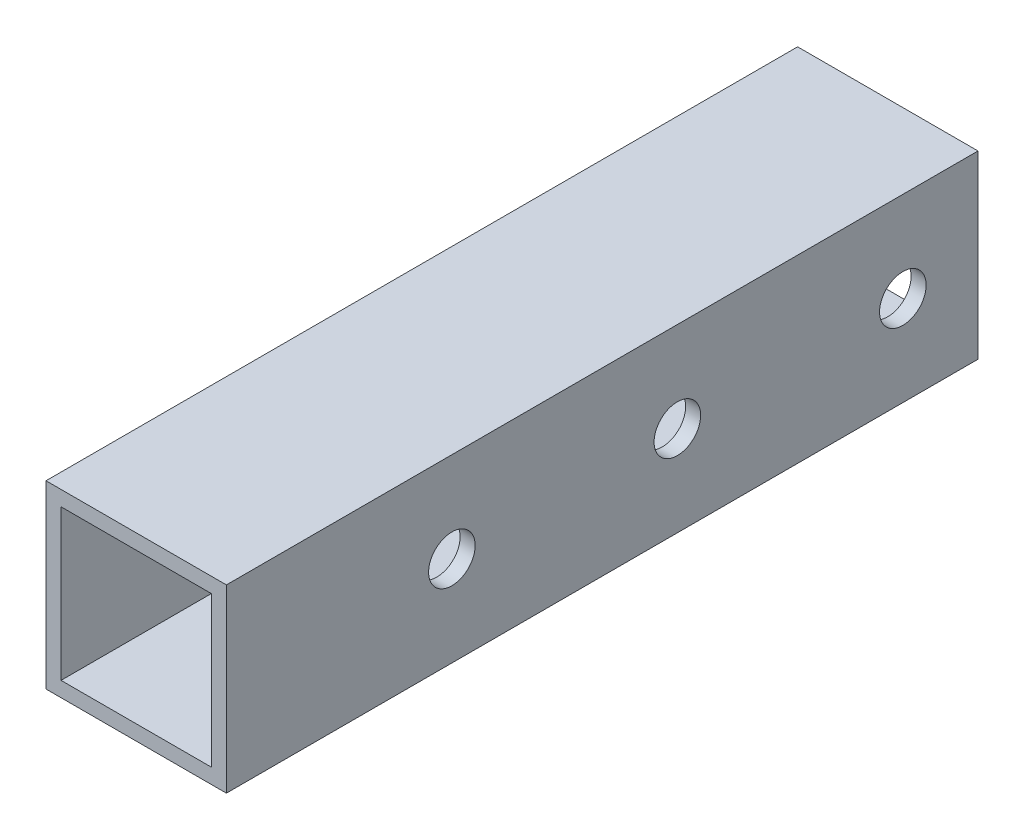
ISO-10303-21;
HEADER;
FILE_DESCRIPTION(('STEP AP214'),'2;1');
FILE_NAME('part.step','',(''),(''),'','','');
FILE_SCHEMA(('AUTOMOTIVE_DESIGN { 1 0 10303 214 1 1 1 1 }'));
ENDSEC;
DATA;
#1=APPLICATION_CONTEXT('core data for automotive mechanical design processes');
#2=APPLICATION_PROTOCOL_DEFINITION('international standard','automotive_design',2000,#1);
#3=PRODUCT_CONTEXT('',#1,'mechanical');
#4=PRODUCT('Part','Part','',(#3));
#5=PRODUCT_RELATED_PRODUCT_CATEGORY('part','',(#4));
#6=PRODUCT_DEFINITION_FORMATION('','',#4);
#7=PRODUCT_DEFINITION_CONTEXT('part definition',#1,'design');
#8=PRODUCT_DEFINITION('design','',#6,#7);
#9=PRODUCT_DEFINITION_SHAPE('','',#8);
#10=(LENGTH_UNIT() NAMED_UNIT(*) SI_UNIT(.MILLI.,.METRE.));
#11=(NAMED_UNIT(*) PLANE_ANGLE_UNIT() SI_UNIT($,.RADIAN.));
#12=(NAMED_UNIT(*) SI_UNIT($,.STERADIAN.) SOLID_ANGLE_UNIT());
#13=UNCERTAINTY_MEASURE_WITH_UNIT(LENGTH_MEASURE(1.E-05),#10,'distance_accuracy_value','');
#14=(GEOMETRIC_REPRESENTATION_CONTEXT(3) GLOBAL_UNCERTAINTY_ASSIGNED_CONTEXT((#13)) GLOBAL_UNIT_ASSIGNED_CONTEXT((#10,
#11,#12)) REPRESENTATION_CONTEXT('',''));
#15=CARTESIAN_POINT('',(0.,0.,0.));
#16=DIRECTION('',(0.,0.,1.));
#17=DIRECTION('',(1.,0.,0.));
#18=AXIS2_PLACEMENT_3D('',#15,#16,#17);
#19=CARTESIAN_POINT('',(0.,0.,-50.));
#20=DIRECTION('',(0.,0.,1.));
#21=DIRECTION('',(-1.,0.,0.));
#22=AXIS2_PLACEMENT_3D('',#19,#20,#21);
#23=PLANE('',#22);
#24=DIRECTION('',(0.,-1.,0.));
#25=VECTOR('',#24,1.);
#26=CARTESIAN_POINT('',(0.,0.,-50.));
#27=LINE('',#26,#25);
#28=CARTESIAN_POINT('',(0.,12.,-50.));
#29=VERTEX_POINT('',#28);
#30=CARTESIAN_POINT('',(0.,0.,-50.));
#31=VERTEX_POINT('',#30);
#32=EDGE_CURVE('E147',#29,#31,#27,.T.);
#33=ORIENTED_EDGE('',*,*,#32,.F.);
#34=DIRECTION('',(-1.,0.,0.));
#35=VECTOR('',#34,1.);
#36=CARTESIAN_POINT('',(0.,12.,-50.));
#37=LINE('',#36,#35);
#38=CARTESIAN_POINT('',(12.,12.,-50.));
#39=VERTEX_POINT('',#38);
#40=EDGE_CURVE('E157',#39,#29,#37,.T.);
#41=ORIENTED_EDGE('',*,*,#40,.F.);
#42=DIRECTION('',(0.,1.,0.));
#43=VECTOR('',#42,1.);
#44=CARTESIAN_POINT('',(12.,0.,-50.));
#45=LINE('',#44,#43);
#46=CARTESIAN_POINT('',(12.,0.,-50.));
#47=VERTEX_POINT('',#46);
#48=EDGE_CURVE('E154',#47,#39,#45,.T.);
#49=ORIENTED_EDGE('',*,*,#48,.F.);
#50=DIRECTION('',(1.,0.,0.));
#51=VECTOR('',#50,1.);
#52=CARTESIAN_POINT('',(0.,0.,-50.));
#53=LINE('',#52,#51);
#54=EDGE_CURVE('E150',#31,#47,#53,.T.);
#55=ORIENTED_EDGE('',*,*,#54,.F.);
#56=EDGE_LOOP('',(#33,#41,#49,#55));
#57=FACE_BOUND('',#56,.T.);
#58=DIRECTION('',(1.,0.,0.));
#59=VECTOR('',#58,1.);
#60=CARTESIAN_POINT('',(1.,1.,-50.));
#61=LINE('',#60,#59);
#62=CARTESIAN_POINT('',(1.,1.,-50.));
#63=VERTEX_POINT('',#62);
#64=CARTESIAN_POINT('',(11.,1.,-50.));
#65=VERTEX_POINT('',#64);
#66=EDGE_CURVE('E112',#63,#65,#61,.T.);
#67=ORIENTED_EDGE('',*,*,#66,.T.);
#68=DIRECTION('',(0.,1.,0.));
#69=VECTOR('',#68,1.);
#70=CARTESIAN_POINT('',(11.,1.,-50.));
#71=LINE('',#70,#69);
#72=CARTESIAN_POINT('',(11.,11.,-50.));
#73=VERTEX_POINT('',#72);
#74=EDGE_CURVE('E121',#65,#73,#71,.T.);
#75=ORIENTED_EDGE('',*,*,#74,.T.);
#76=DIRECTION('',(-1.,0.,0.));
#77=VECTOR('',#76,1.);
#78=CARTESIAN_POINT('',(1.,11.,-50.));
#79=LINE('',#78,#77);
#80=CARTESIAN_POINT('',(1.,11.,-50.));
#81=VERTEX_POINT('',#80);
#82=EDGE_CURVE('E125',#73,#81,#79,.T.);
#83=ORIENTED_EDGE('',*,*,#82,.T.);
#84=DIRECTION('',(0.,-1.,0.));
#85=VECTOR('',#84,1.);
#86=CARTESIAN_POINT('',(1.,1.,-50.));
#87=LINE('',#86,#85);
#88=EDGE_CURVE('E128',#81,#63,#87,.T.);
#89=ORIENTED_EDGE('',*,*,#88,.T.);
#90=EDGE_LOOP('',(#67,#75,#83,#89));
#91=FACE_BOUND('',#90,.T.);
#92=ADVANCED_FACE('F43',(#57,#91),#23,.F.);
#93=CARTESIAN_POINT('',(0.,0.,0.));
#94=DIRECTION('',(0.,0.,1.));
#95=DIRECTION('',(-1.,0.,0.));
#96=AXIS2_PLACEMENT_3D('',#93,#94,#95);
#97=PLANE('',#96);
#98=DIRECTION('',(0.,-1.,0.));
#99=VECTOR('',#98,1.);
#100=CARTESIAN_POINT('',(0.,0.,0.));
#101=LINE('',#100,#99);
#102=CARTESIAN_POINT('',(0.,12.,0.));
#103=VERTEX_POINT('',#102);
#104=CARTESIAN_POINT('',(0.,0.,0.));
#105=VERTEX_POINT('',#104);
#106=EDGE_CURVE('E117',#103,#105,#101,.T.);
#107=ORIENTED_EDGE('',*,*,#106,.T.);
#108=DIRECTION('',(1.,0.,0.));
#109=VECTOR('',#108,1.);
#110=CARTESIAN_POINT('',(0.,0.,0.));
#111=LINE('',#110,#109);
#112=CARTESIAN_POINT('',(12.,0.,0.));
#113=VERTEX_POINT('',#112);
#114=EDGE_CURVE('E163',#105,#113,#111,.T.);
#115=ORIENTED_EDGE('',*,*,#114,.T.);
#116=DIRECTION('',(0.,1.,0.));
#117=VECTOR('',#116,1.);
#118=CARTESIAN_POINT('',(12.,0.,0.));
#119=LINE('',#118,#117);
#120=CARTESIAN_POINT('',(12.,12.,0.));
#121=VERTEX_POINT('',#120);
#122=EDGE_CURVE('E166',#113,#121,#119,.T.);
#123=ORIENTED_EDGE('',*,*,#122,.T.);
#124=DIRECTION('',(-1.,0.,0.));
#125=VECTOR('',#124,1.);
#126=CARTESIAN_POINT('',(0.,12.,0.));
#127=LINE('',#126,#125);
#128=EDGE_CURVE('E151',#121,#103,#127,.T.);
#129=ORIENTED_EDGE('',*,*,#128,.T.);
#130=EDGE_LOOP('',(#107,#115,#123,#129));
#131=FACE_BOUND('',#130,.T.);
#132=DIRECTION('',(0.,-1.,0.));
#133=VECTOR('',#132,1.);
#134=CARTESIAN_POINT('',(1.,1.,0.));
#135=LINE('',#134,#133);
#136=CARTESIAN_POINT('',(1.,11.,0.));
#137=VERTEX_POINT('',#136);
#138=CARTESIAN_POINT('',(1.,1.,0.));
#139=VERTEX_POINT('',#138);
#140=EDGE_CURVE('E129',#137,#139,#135,.T.);
#141=ORIENTED_EDGE('',*,*,#140,.F.);
#142=DIRECTION('',(-1.,0.,0.));
#143=VECTOR('',#142,1.);
#144=CARTESIAN_POINT('',(1.,11.,0.));
#145=LINE('',#144,#143);
#146=CARTESIAN_POINT('',(11.,11.,0.));
#147=VERTEX_POINT('',#146);
#148=EDGE_CURVE('E132',#147,#137,#145,.T.);
#149=ORIENTED_EDGE('',*,*,#148,.F.);
#150=DIRECTION('',(0.,1.,0.));
#151=VECTOR('',#150,1.);
#152=CARTESIAN_POINT('',(11.,1.,0.));
#153=LINE('',#152,#151);
#154=CARTESIAN_POINT('',(11.,1.,0.));
#155=VERTEX_POINT('',#154);
#156=EDGE_CURVE('E141',#155,#147,#153,.T.);
#157=ORIENTED_EDGE('',*,*,#156,.F.);
#158=DIRECTION('',(1.,0.,0.));
#159=VECTOR('',#158,1.);
#160=CARTESIAN_POINT('',(1.,1.,0.));
#161=LINE('',#160,#159);
#162=EDGE_CURVE('E113',#139,#155,#161,.T.);
#163=ORIENTED_EDGE('',*,*,#162,.F.);
#164=EDGE_LOOP('',(#141,#149,#157,#163));
#165=FACE_BOUND('',#164,.T.);
#166=ADVANCED_FACE('F224',(#131,#165),#97,.T.);
#167=CARTESIAN_POINT('',(0.,0.,-50.));
#168=DIRECTION('',(1.,0.,0.));
#169=DIRECTION('',(0.,0.,1.));
#170=AXIS2_PLACEMENT_3D('',#167,#168,#169);
#171=PLANE('',#170);
#172=CARTESIAN_POINT('',(0.,6.,-15.));
#173=DIRECTION('',(1.,0.,0.));
#174=DIRECTION('',(0.,0.,-1.));
#175=AXIS2_PLACEMENT_3D('',#172,#173,#174);
#176=CIRCLE('',#175,1.55);
#177=CARTESIAN_POINT('',(0.,6.,-16.55));
#178=VERTEX_POINT('',#177);
#179=EDGE_CURVE('E202',#178,#178,#176,.T.);
#180=ORIENTED_EDGE('',*,*,#179,.T.);
#181=EDGE_LOOP('',(#180));
#182=FACE_BOUND('',#181,.T.);
#183=CARTESIAN_POINT('',(0.,6.,-30.));
#184=DIRECTION('',(1.,0.,0.));
#185=DIRECTION('',(0.,0.,-1.));
#186=AXIS2_PLACEMENT_3D('',#183,#184,#185);
#187=CIRCLE('',#186,1.55);
#188=CARTESIAN_POINT('',(0.,6.,-31.55));
#189=VERTEX_POINT('',#188);
#190=EDGE_CURVE('E199',#189,#189,#187,.T.);
#191=ORIENTED_EDGE('',*,*,#190,.T.);
#192=EDGE_LOOP('',(#191));
#193=FACE_BOUND('',#192,.T.);
#194=CARTESIAN_POINT('',(0.,6.,-45.));
#195=DIRECTION('',(1.,0.,0.));
#196=DIRECTION('',(0.,0.,-1.));
#197=AXIS2_PLACEMENT_3D('',#194,#195,#196);
#198=CIRCLE('',#197,1.55);
#199=CARTESIAN_POINT('',(0.,6.,-46.55));
#200=VERTEX_POINT('',#199);
#201=EDGE_CURVE('E193',#200,#200,#198,.T.);
#202=ORIENTED_EDGE('',*,*,#201,.T.);
#203=EDGE_LOOP('',(#202));
#204=FACE_BOUND('',#203,.T.);
#205=ORIENTED_EDGE('',*,*,#106,.F.);
#206=DIRECTION('',(0.,0.,1.));
#207=VECTOR('',#206,1.);
#208=CARTESIAN_POINT('',(0.,12.,-50.));
#209=LINE('',#208,#207);
#210=EDGE_CURVE('E160',#29,#103,#209,.T.);
#211=ORIENTED_EDGE('',*,*,#210,.F.);
#212=ORIENTED_EDGE('',*,*,#32,.T.);
#213=DIRECTION('',(0.,0.,1.));
#214=VECTOR('',#213,1.);
#215=CARTESIAN_POINT('',(0.,0.,-50.));
#216=LINE('',#215,#214);
#217=EDGE_CURVE('E11',#31,#105,#216,.T.);
#218=ORIENTED_EDGE('',*,*,#217,.T.);
#219=EDGE_LOOP('',(#205,#211,#212,#218));
#220=FACE_BOUND('',#219,.T.);
#221=ADVANCED_FACE('F45',(#182,#193,#204,#220),#171,.F.);
#222=CARTESIAN_POINT('',(0.,0.,-50.));
#223=DIRECTION('',(0.,1.,0.));
#224=DIRECTION('',(0.,0.,-1.));
#225=AXIS2_PLACEMENT_3D('',#222,#223,#224);
#226=PLANE('',#225);
#227=ORIENTED_EDGE('',*,*,#114,.F.);
#228=ORIENTED_EDGE('',*,*,#217,.F.);
#229=ORIENTED_EDGE('',*,*,#54,.T.);
#230=DIRECTION('',(0.,0.,1.));
#231=VECTOR('',#230,1.);
#232=CARTESIAN_POINT('',(12.,0.,-50.));
#233=LINE('',#232,#231);
#234=EDGE_CURVE('E52',#47,#113,#233,.T.);
#235=ORIENTED_EDGE('',*,*,#234,.T.);
#236=EDGE_LOOP('',(#227,#228,#229,#235));
#237=FACE_BOUND('',#236,.T.);
#238=ADVANCED_FACE('F214',(#237),#226,.F.);
#239=CARTESIAN_POINT('',(12.,0.,-50.));
#240=DIRECTION('',(-1.,0.,0.));
#241=DIRECTION('',(0.,0.,-1.));
#242=AXIS2_PLACEMENT_3D('',#239,#240,#241);
#243=PLANE('',#242);
#244=CARTESIAN_POINT('',(12.,6.,-15.));
#245=DIRECTION('',(1.,0.,0.));
#246=DIRECTION('',(0.,0.,-1.));
#247=AXIS2_PLACEMENT_3D('',#244,#245,#246);
#248=CIRCLE('',#247,1.55);
#249=CARTESIAN_POINT('',(12.,6.,-16.55));
#250=VERTEX_POINT('',#249);
#251=EDGE_CURVE('E178',#250,#250,#248,.T.);
#252=ORIENTED_EDGE('',*,*,#251,.F.);
#253=EDGE_LOOP('',(#252));
#254=FACE_BOUND('',#253,.T.);
#255=CARTESIAN_POINT('',(12.,6.,-30.));
#256=DIRECTION('',(1.,0.,0.));
#257=DIRECTION('',(0.,0.,-1.));
#258=AXIS2_PLACEMENT_3D('',#255,#256,#257);
#259=CIRCLE('',#258,1.55);
#260=CARTESIAN_POINT('',(12.,6.,-31.55));
#261=VERTEX_POINT('',#260);
#262=EDGE_CURVE('E196',#261,#261,#259,.T.);
#263=ORIENTED_EDGE('',*,*,#262,.F.);
#264=EDGE_LOOP('',(#263));
#265=FACE_BOUND('',#264,.T.);
#266=CARTESIAN_POINT('',(12.,6.,-45.));
#267=DIRECTION('',(1.,0.,0.));
#268=DIRECTION('',(0.,0.,-1.));
#269=AXIS2_PLACEMENT_3D('',#266,#267,#268);
#270=CIRCLE('',#269,1.55);
#271=CARTESIAN_POINT('',(12.,6.,-46.55));
#272=VERTEX_POINT('',#271);
#273=EDGE_CURVE('E190',#272,#272,#270,.T.);
#274=ORIENTED_EDGE('',*,*,#273,.F.);
#275=EDGE_LOOP('',(#274));
#276=FACE_BOUND('',#275,.T.);
#277=ORIENTED_EDGE('',*,*,#122,.F.);
#278=ORIENTED_EDGE('',*,*,#234,.F.);
#279=ORIENTED_EDGE('',*,*,#48,.T.);
#280=DIRECTION('',(0.,0.,1.));
#281=VECTOR('',#280,1.);
#282=CARTESIAN_POINT('',(12.,12.,-50.));
#283=LINE('',#282,#281);
#284=EDGE_CURVE('E172',#39,#121,#283,.T.);
#285=ORIENTED_EDGE('',*,*,#284,.T.);
#286=EDGE_LOOP('',(#277,#278,#279,#285));
#287=FACE_BOUND('',#286,.T.);
#288=ADVANCED_FACE('F210',(#254,#265,#276,#287),#243,.F.);
#289=CARTESIAN_POINT('',(0.,12.,-50.));
#290=DIRECTION('',(0.,-1.,0.));
#291=DIRECTION('',(0.,0.,1.));
#292=AXIS2_PLACEMENT_3D('',#289,#290,#291);
#293=PLANE('',#292);
#294=ORIENTED_EDGE('',*,*,#128,.F.);
#295=ORIENTED_EDGE('',*,*,#284,.F.);
#296=ORIENTED_EDGE('',*,*,#40,.T.);
#297=ORIENTED_EDGE('',*,*,#210,.T.);
#298=EDGE_LOOP('',(#294,#295,#296,#297));
#299=FACE_BOUND('',#298,.T.);
#300=ADVANCED_FACE('F213',(#299),#293,.F.);
#301=CARTESIAN_POINT('',(1.,1.,-50.));
#302=DIRECTION('',(0.,1.,0.));
#303=DIRECTION('',(0.,0.,-1.));
#304=AXIS2_PLACEMENT_3D('',#301,#302,#303);
#305=PLANE('',#304);
#306=ORIENTED_EDGE('',*,*,#162,.T.);
#307=DIRECTION('',(0.,0.,1.));
#308=VECTOR('',#307,1.);
#309=CARTESIAN_POINT('',(11.,1.,-50.));
#310=LINE('',#309,#308);
#311=EDGE_CURVE('E108',#65,#155,#310,.T.);
#312=ORIENTED_EDGE('',*,*,#311,.F.);
#313=ORIENTED_EDGE('',*,*,#66,.F.);
#314=DIRECTION('',(0.,0.,1.));
#315=VECTOR('',#314,1.);
#316=CARTESIAN_POINT('',(1.,1.,-50.));
#317=LINE('',#316,#315);
#318=EDGE_CURVE('E68',#63,#139,#317,.T.);
#319=ORIENTED_EDGE('',*,*,#318,.T.);
#320=EDGE_LOOP('',(#306,#312,#313,#319));
#321=FACE_BOUND('',#320,.T.);
#322=ADVANCED_FACE('F110',(#321),#305,.T.);
#323=CARTESIAN_POINT('',(11.,1.,-50.));
#324=DIRECTION('',(-1.,0.,0.));
#325=DIRECTION('',(0.,0.,-1.));
#326=AXIS2_PLACEMENT_3D('',#323,#324,#325);
#327=PLANE('',#326);
#328=CARTESIAN_POINT('',(11.,6.,-15.));
#329=DIRECTION('',(1.,0.,0.));
#330=DIRECTION('',(0.,0.,-1.));
#331=AXIS2_PLACEMENT_3D('',#328,#329,#330);
#332=CIRCLE('',#331,1.55);
#333=CARTESIAN_POINT('',(11.,6.,-16.55));
#334=VERTEX_POINT('',#333);
#335=EDGE_CURVE('E135',#334,#334,#332,.T.);
#336=ORIENTED_EDGE('',*,*,#335,.T.);
#337=EDGE_LOOP('',(#336));
#338=FACE_BOUND('',#337,.T.);
#339=CARTESIAN_POINT('',(11.,6.,-30.));
#340=DIRECTION('',(1.,0.,0.));
#341=DIRECTION('',(0.,0.,-1.));
#342=AXIS2_PLACEMENT_3D('',#339,#340,#341);
#343=CIRCLE('',#342,1.55);
#344=CARTESIAN_POINT('',(11.,6.,-31.55));
#345=VERTEX_POINT('',#344);
#346=EDGE_CURVE('E181',#345,#345,#343,.T.);
#347=ORIENTED_EDGE('',*,*,#346,.T.);
#348=EDGE_LOOP('',(#347));
#349=FACE_BOUND('',#348,.T.);
#350=CARTESIAN_POINT('',(11.,6.,-45.));
#351=DIRECTION('',(1.,0.,0.));
#352=DIRECTION('',(0.,0.,-1.));
#353=AXIS2_PLACEMENT_3D('',#350,#351,#352);
#354=CIRCLE('',#353,1.55);
#355=CARTESIAN_POINT('',(11.,6.,-46.55));
#356=VERTEX_POINT('',#355);
#357=EDGE_CURVE('E177',#356,#356,#354,.T.);
#358=ORIENTED_EDGE('',*,*,#357,.T.);
#359=EDGE_LOOP('',(#358));
#360=FACE_BOUND('',#359,.T.);
#361=ORIENTED_EDGE('',*,*,#156,.T.);
#362=DIRECTION('',(0.,0.,1.));
#363=VECTOR('',#362,1.);
#364=CARTESIAN_POINT('',(11.,11.,-50.));
#365=LINE('',#364,#363);
#366=EDGE_CURVE('E118',#73,#147,#365,.T.);
#367=ORIENTED_EDGE('',*,*,#366,.F.);
#368=ORIENTED_EDGE('',*,*,#74,.F.);
#369=ORIENTED_EDGE('',*,*,#311,.T.);
#370=EDGE_LOOP('',(#361,#367,#368,#369));
#371=FACE_BOUND('',#370,.T.);
#372=ADVANCED_FACE('F122',(#338,#349,#360,#371),#327,.T.);
#373=CARTESIAN_POINT('',(1.,11.,-50.));
#374=DIRECTION('',(0.,-1.,0.));
#375=DIRECTION('',(0.,0.,1.));
#376=AXIS2_PLACEMENT_3D('',#373,#374,#375);
#377=PLANE('',#376);
#378=ORIENTED_EDGE('',*,*,#148,.T.);
#379=DIRECTION('',(0.,0.,1.));
#380=VECTOR('',#379,1.);
#381=CARTESIAN_POINT('',(1.,11.,-50.));
#382=LINE('',#381,#380);
#383=EDGE_CURVE('E60',#81,#137,#382,.T.);
#384=ORIENTED_EDGE('',*,*,#383,.F.);
#385=ORIENTED_EDGE('',*,*,#82,.F.);
#386=ORIENTED_EDGE('',*,*,#366,.T.);
#387=EDGE_LOOP('',(#378,#384,#385,#386));
#388=FACE_BOUND('',#387,.T.);
#389=ADVANCED_FACE('F257',(#388),#377,.T.);
#390=CARTESIAN_POINT('',(1.,1.,-50.));
#391=DIRECTION('',(1.,0.,0.));
#392=DIRECTION('',(0.,0.,1.));
#393=AXIS2_PLACEMENT_3D('',#390,#391,#392);
#394=PLANE('',#393);
#395=CARTESIAN_POINT('',(1.,6.,-15.));
#396=DIRECTION('',(-1.,0.,0.));
#397=DIRECTION('',(0.,0.,1.));
#398=AXIS2_PLACEMENT_3D('',#395,#396,#397);
#399=CIRCLE('',#398,1.55);
#400=CARTESIAN_POINT('',(1.,6.,-13.45));
#401=VERTEX_POINT('',#400);
#402=EDGE_CURVE('E47',#401,#401,#399,.T.);
#403=ORIENTED_EDGE('',*,*,#402,.T.);
#404=EDGE_LOOP('',(#403));
#405=FACE_BOUND('',#404,.T.);
#406=CARTESIAN_POINT('',(1.,6.,-30.));
#407=DIRECTION('',(-1.,0.,0.));
#408=DIRECTION('',(0.,0.,1.));
#409=AXIS2_PLACEMENT_3D('',#406,#407,#408);
#410=CIRCLE('',#409,1.55);
#411=CARTESIAN_POINT('',(1.,6.,-28.45));
#412=VERTEX_POINT('',#411);
#413=EDGE_CURVE('E179',#412,#412,#410,.T.);
#414=ORIENTED_EDGE('',*,*,#413,.T.);
#415=EDGE_LOOP('',(#414));
#416=FACE_BOUND('',#415,.T.);
#417=CARTESIAN_POINT('',(1.,6.,-45.));
#418=DIRECTION('',(-1.,0.,0.));
#419=DIRECTION('',(0.,0.,1.));
#420=AXIS2_PLACEMENT_3D('',#417,#418,#419);
#421=CIRCLE('',#420,1.55);
#422=CARTESIAN_POINT('',(1.,6.,-43.45));
#423=VERTEX_POINT('',#422);
#424=EDGE_CURVE('E175',#423,#423,#421,.T.);
#425=ORIENTED_EDGE('',*,*,#424,.T.);
#426=EDGE_LOOP('',(#425));
#427=FACE_BOUND('',#426,.T.);
#428=ORIENTED_EDGE('',*,*,#140,.T.);
#429=ORIENTED_EDGE('',*,*,#318,.F.);
#430=ORIENTED_EDGE('',*,*,#88,.F.);
#431=ORIENTED_EDGE('',*,*,#383,.T.);
#432=EDGE_LOOP('',(#428,#429,#430,#431));
#433=FACE_BOUND('',#432,.T.);
#434=ADVANCED_FACE('F262',(#405,#416,#427,#433),#394,.T.);
#435=CARTESIAN_POINT('',(12.,6.,-45.));
#436=DIRECTION('',(-1.,0.,0.));
#437=DIRECTION('',(0.,0.,-1.));
#438=AXIS2_PLACEMENT_3D('',#435,#436,#437);
#439=CYLINDRICAL_SURFACE('',#438,1.55);
#440=ORIENTED_EDGE('',*,*,#424,.F.);
#441=EDGE_LOOP('',(#440));
#442=FACE_BOUND('',#441,.T.);
#443=ORIENTED_EDGE('',*,*,#201,.F.);
#444=EDGE_LOOP('',(#443));
#445=FACE_BOUND('',#444,.T.);
#446=ADVANCED_FACE('F269',(#442,#445),#439,.F.);
#447=CARTESIAN_POINT('',(12.,6.,-30.));
#448=DIRECTION('',(-1.,0.,0.));
#449=DIRECTION('',(0.,0.,-1.));
#450=AXIS2_PLACEMENT_3D('',#447,#448,#449);
#451=CYLINDRICAL_SURFACE('',#450,1.55);
#452=ORIENTED_EDGE('',*,*,#413,.F.);
#453=EDGE_LOOP('',(#452));
#454=FACE_BOUND('',#453,.T.);
#455=ORIENTED_EDGE('',*,*,#190,.F.);
#456=EDGE_LOOP('',(#455));
#457=FACE_BOUND('',#456,.T.);
#458=ADVANCED_FACE('F273',(#454,#457),#451,.F.);
#459=CARTESIAN_POINT('',(12.,6.,-15.));
#460=DIRECTION('',(-1.,0.,0.));
#461=DIRECTION('',(0.,0.,-1.));
#462=AXIS2_PLACEMENT_3D('',#459,#460,#461);
#463=CYLINDRICAL_SURFACE('',#462,1.55);
#464=ORIENTED_EDGE('',*,*,#402,.F.);
#465=EDGE_LOOP('',(#464));
#466=FACE_BOUND('',#465,.T.);
#467=ORIENTED_EDGE('',*,*,#179,.F.);
#468=EDGE_LOOP('',(#467));
#469=FACE_BOUND('',#468,.T.);
#470=ADVANCED_FACE('F278',(#466,#469),#463,.F.);
#471=ORIENTED_EDGE('',*,*,#357,.F.);
#472=EDGE_LOOP('',(#471));
#473=FACE_BOUND('',#472,.T.);
#474=ORIENTED_EDGE('',*,*,#273,.T.);
#475=EDGE_LOOP('',(#474));
#476=FACE_BOUND('',#475,.T.);
#477=ADVANCED_FACE('F275',(#473,#476),#439,.F.);
#478=ORIENTED_EDGE('',*,*,#346,.F.);
#479=EDGE_LOOP('',(#478));
#480=FACE_BOUND('',#479,.T.);
#481=ORIENTED_EDGE('',*,*,#262,.T.);
#482=EDGE_LOOP('',(#481));
#483=FACE_BOUND('',#482,.T.);
#484=ADVANCED_FACE('F280',(#480,#483),#451,.F.);
#485=ORIENTED_EDGE('',*,*,#335,.F.);
#486=EDGE_LOOP('',(#485));
#487=FACE_BOUND('',#486,.T.);
#488=ORIENTED_EDGE('',*,*,#251,.T.);
#489=EDGE_LOOP('',(#488));
#490=FACE_BOUND('',#489,.T.);
#491=ADVANCED_FACE('F208',(#487,#490),#463,.F.);
#492=CLOSED_SHELL('',(#92,#166,#221,#238,#288,#300,#322,#372,#389,#434,#446,#458,#470,#477,#484,#491));
#493=MANIFOLD_SOLID_BREP('B2',#492);
#494=ADVANCED_BREP_SHAPE_REPRESENTATION('',(#18,#493),#14);
#495=SHAPE_DEFINITION_REPRESENTATION(#9,#494);
ENDSEC;
END-ISO-10303-21;
